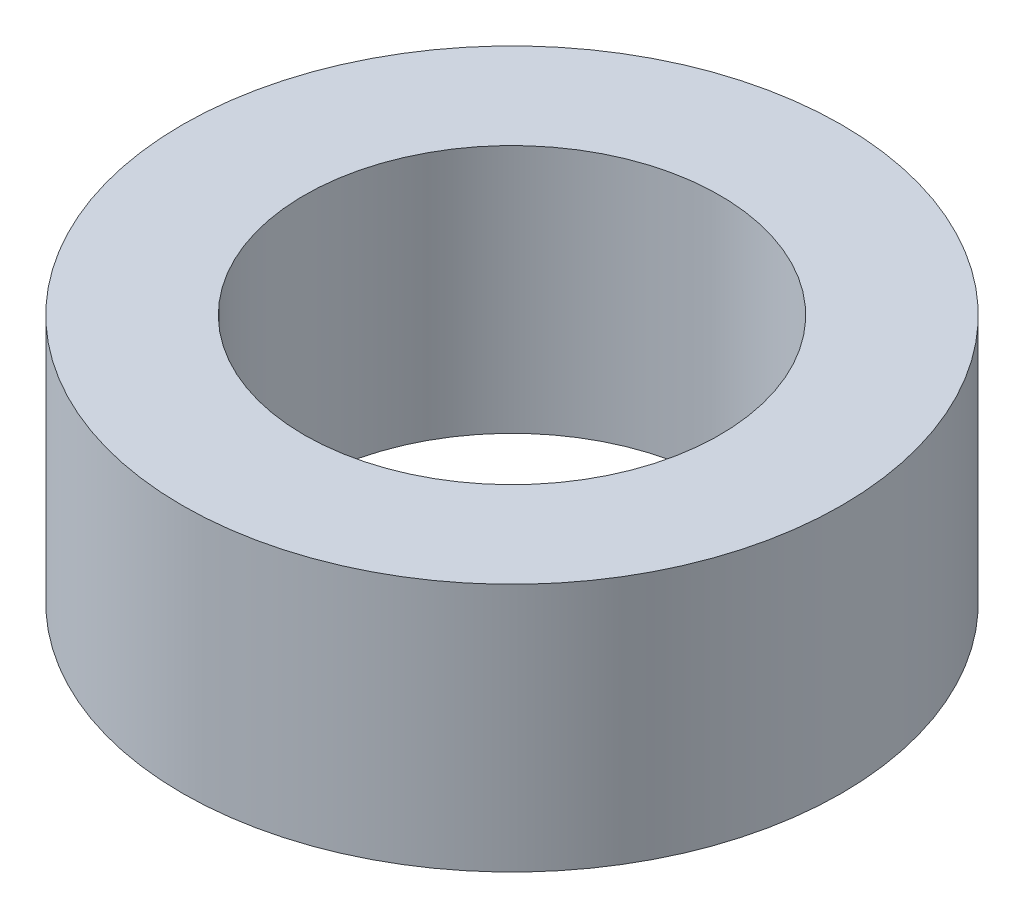
ISO-10303-21;
HEADER;
FILE_DESCRIPTION(('STEP AP214'),'2;1');
FILE_NAME('part.step','',(''),(''),'','','');
FILE_SCHEMA(('AUTOMOTIVE_DESIGN { 1 0 10303 214 1 1 1 1 }'));
ENDSEC;
DATA;
#1=APPLICATION_CONTEXT('core data for automotive mechanical design processes');
#2=APPLICATION_PROTOCOL_DEFINITION('international standard','automotive_design',2000,#1);
#3=PRODUCT_CONTEXT('',#1,'mechanical');
#4=PRODUCT('Part','Part','',(#3));
#5=PRODUCT_RELATED_PRODUCT_CATEGORY('part','',(#4));
#6=PRODUCT_DEFINITION_FORMATION('','',#4);
#7=PRODUCT_DEFINITION_CONTEXT('part definition',#1,'design');
#8=PRODUCT_DEFINITION('design','',#6,#7);
#9=PRODUCT_DEFINITION_SHAPE('','',#8);
#10=(LENGTH_UNIT() NAMED_UNIT(*) SI_UNIT(.MILLI.,.METRE.));
#11=(NAMED_UNIT(*) PLANE_ANGLE_UNIT() SI_UNIT($,.RADIAN.));
#12=(NAMED_UNIT(*) SI_UNIT($,.STERADIAN.) SOLID_ANGLE_UNIT());
#13=UNCERTAINTY_MEASURE_WITH_UNIT(LENGTH_MEASURE(1.E-05),#10,'distance_accuracy_value','');
#14=(GEOMETRIC_REPRESENTATION_CONTEXT(3) GLOBAL_UNCERTAINTY_ASSIGNED_CONTEXT((#13)) GLOBAL_UNIT_ASSIGNED_CONTEXT((#10,
#11,#12)) REPRESENTATION_CONTEXT('',''));
#15=CARTESIAN_POINT('',(0.,0.,0.));
#16=DIRECTION('',(0.,0.,1.));
#17=DIRECTION('',(1.,0.,0.));
#18=AXIS2_PLACEMENT_3D('',#15,#16,#17);
#19=CARTESIAN_POINT('',(0.,4.8,0.));
#20=DIRECTION('',(0.,-1.,0.));
#21=DIRECTION('',(0.,0.,-1.));
#22=AXIS2_PLACEMENT_3D('',#19,#20,#21);
#23=CYLINDRICAL_SURFACE('',#22,6.35);
#24=CARTESIAN_POINT('',(0.,4.8,0.));
#25=DIRECTION('',(0.,1.,0.));
#26=DIRECTION('',(0.,0.,1.));
#27=AXIS2_PLACEMENT_3D('',#24,#25,#26);
#28=CIRCLE('',#27,6.35);
#29=CARTESIAN_POINT('',(0.,4.8,6.35));
#30=VERTEX_POINT('',#29);
#31=EDGE_CURVE('E10',#30,#30,#28,.T.);
#32=ORIENTED_EDGE('',*,*,#31,.F.);
#33=EDGE_LOOP('',(#32));
#34=FACE_BOUND('',#33,.T.);
#35=CARTESIAN_POINT('',(0.,0.,0.));
#36=DIRECTION('',(0.,1.,0.));
#37=DIRECTION('',(0.,0.,1.));
#38=AXIS2_PLACEMENT_3D('',#35,#36,#37);
#39=CIRCLE('',#38,6.35);
#40=CARTESIAN_POINT('',(0.,0.,6.35));
#41=VERTEX_POINT('',#40);
#42=EDGE_CURVE('E48',#41,#41,#39,.T.);
#43=ORIENTED_EDGE('',*,*,#42,.T.);
#44=EDGE_LOOP('',(#43));
#45=FACE_BOUND('',#44,.T.);
#46=ADVANCED_FACE('F45',(#34,#45),#23,.T.);
#47=CARTESIAN_POINT('',(0.,4.8,0.));
#48=DIRECTION('',(0.,1.,0.));
#49=DIRECTION('',(0.,0.,1.));
#50=AXIS2_PLACEMENT_3D('',#47,#48,#49);
#51=PLANE('',#50);
#52=CARTESIAN_POINT('',(0.,4.8,0.));
#53=DIRECTION('',(0.,1.,0.));
#54=DIRECTION('',(0.,0.,1.));
#55=AXIS2_PLACEMENT_3D('',#52,#53,#54);
#56=CIRCLE('',#55,4.);
#57=CARTESIAN_POINT('',(0.,4.8,4.));
#58=VERTEX_POINT('',#57);
#59=EDGE_CURVE('E59',#58,#58,#56,.T.);
#60=ORIENTED_EDGE('',*,*,#59,.F.);
#61=EDGE_LOOP('',(#60));
#62=FACE_BOUND('',#61,.T.);
#63=ORIENTED_EDGE('',*,*,#31,.T.);
#64=EDGE_LOOP('',(#63));
#65=FACE_BOUND('',#64,.T.);
#66=ADVANCED_FACE('F76',(#62,#65),#51,.T.);
#67=CARTESIAN_POINT('',(0.,0.,0.));
#68=DIRECTION('',(0.,1.,0.));
#69=DIRECTION('',(0.,0.,1.));
#70=AXIS2_PLACEMENT_3D('',#67,#68,#69);
#71=PLANE('',#70);
#72=CARTESIAN_POINT('',(0.,0.,0.));
#73=DIRECTION('',(0.,1.,0.));
#74=DIRECTION('',(0.,0.,1.));
#75=AXIS2_PLACEMENT_3D('',#72,#73,#74);
#76=CIRCLE('',#75,4.);
#77=CARTESIAN_POINT('',(0.,0.,4.));
#78=VERTEX_POINT('',#77);
#79=EDGE_CURVE('E57',#78,#78,#76,.T.);
#80=ORIENTED_EDGE('',*,*,#79,.T.);
#81=EDGE_LOOP('',(#80));
#82=FACE_BOUND('',#81,.T.);
#83=ORIENTED_EDGE('',*,*,#42,.F.);
#84=EDGE_LOOP('',(#83));
#85=FACE_BOUND('',#84,.T.);
#86=ADVANCED_FACE('F67',(#82,#85),#71,.F.);
#87=CARTESIAN_POINT('',(0.,0.,0.));
#88=DIRECTION('',(0.,1.,0.));
#89=DIRECTION('',(0.,0.,1.));
#90=AXIS2_PLACEMENT_3D('',#87,#88,#89);
#91=CYLINDRICAL_SURFACE('',#90,4.);
#92=ORIENTED_EDGE('',*,*,#79,.F.);
#93=EDGE_LOOP('',(#92));
#94=FACE_BOUND('',#93,.T.);
#95=ORIENTED_EDGE('',*,*,#59,.T.);
#96=EDGE_LOOP('',(#95));
#97=FACE_BOUND('',#96,.T.);
#98=ADVANCED_FACE('F70',(#94,#97),#91,.F.);
#99=CLOSED_SHELL('',(#46,#66,#86,#98));
#100=MANIFOLD_SOLID_BREP('B2',#99);
#101=ADVANCED_BREP_SHAPE_REPRESENTATION('',(#18,#100),#14);
#102=SHAPE_DEFINITION_REPRESENTATION(#9,#101);
ENDSEC;
END-ISO-10303-21;
